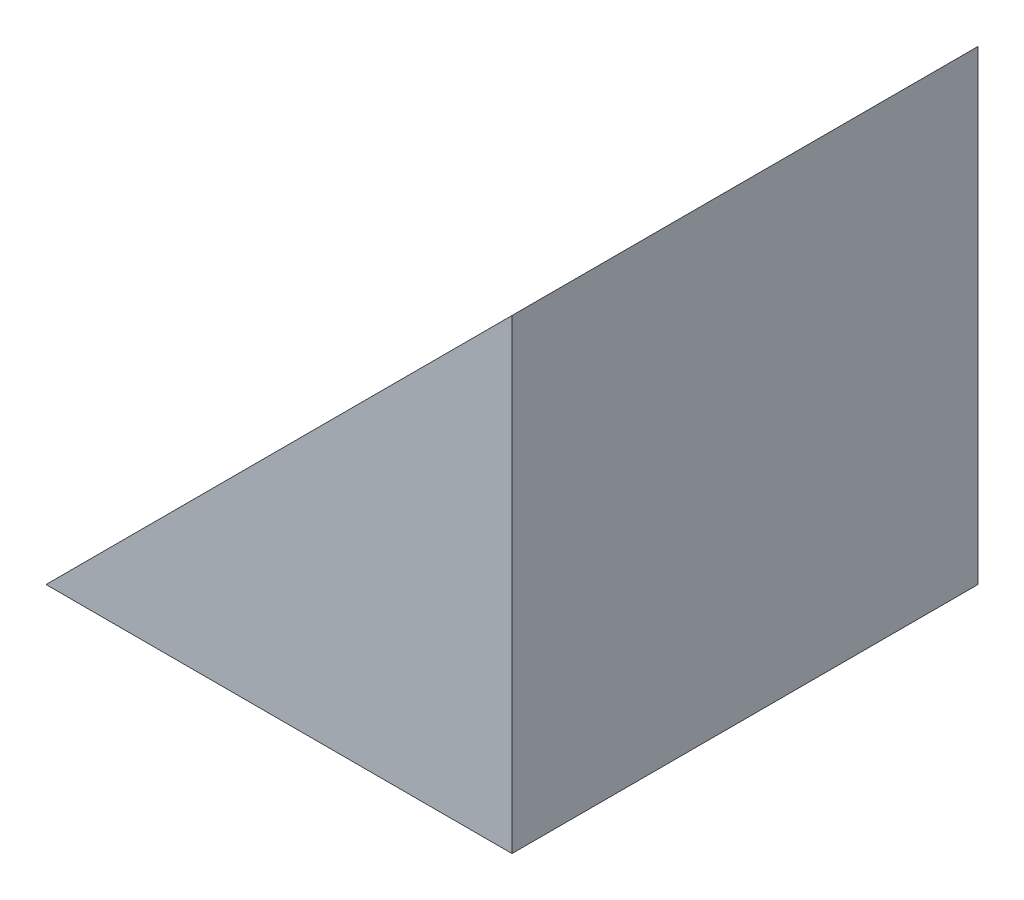
ISO-10303-21;
HEADER;
FILE_DESCRIPTION(('STEP AP214'),'2;1');
FILE_NAME('part.step','',(''),(''),'','','');
FILE_SCHEMA(('AUTOMOTIVE_DESIGN { 1 0 10303 214 1 1 1 1 }'));
ENDSEC;
DATA;
#1=APPLICATION_CONTEXT('core data for automotive mechanical design processes');
#2=APPLICATION_PROTOCOL_DEFINITION('international standard','automotive_design',2000,#1);
#3=PRODUCT_CONTEXT('',#1,'mechanical');
#4=PRODUCT('Part','Part','',(#3));
#5=PRODUCT_RELATED_PRODUCT_CATEGORY('part','',(#4));
#6=PRODUCT_DEFINITION_FORMATION('','',#4);
#7=PRODUCT_DEFINITION_CONTEXT('part definition',#1,'design');
#8=PRODUCT_DEFINITION('design','',#6,#7);
#9=PRODUCT_DEFINITION_SHAPE('','',#8);
#10=(LENGTH_UNIT() NAMED_UNIT(*) SI_UNIT(.MILLI.,.METRE.));
#11=(NAMED_UNIT(*) PLANE_ANGLE_UNIT() SI_UNIT($,.RADIAN.));
#12=(NAMED_UNIT(*) SI_UNIT($,.STERADIAN.) SOLID_ANGLE_UNIT());
#13=UNCERTAINTY_MEASURE_WITH_UNIT(LENGTH_MEASURE(1.E-05),#10,'distance_accuracy_value','');
#14=(GEOMETRIC_REPRESENTATION_CONTEXT(3) GLOBAL_UNCERTAINTY_ASSIGNED_CONTEXT((#13)) GLOBAL_UNIT_ASSIGNED_CONTEXT((#10,
#11,#12)) REPRESENTATION_CONTEXT('',''));
#15=CARTESIAN_POINT('',(0.,0.,0.));
#16=DIRECTION('',(0.,0.,1.));
#17=DIRECTION('',(1.,0.,0.));
#18=AXIS2_PLACEMENT_3D('',#15,#16,#17);
#19=CARTESIAN_POINT('',(1.,1.,2.));
#20=DIRECTION('',(-1.,0.,0.));
#21=DIRECTION('',(0.,-1.,0.));
#22=AXIS2_PLACEMENT_3D('',#19,#20,#21);
#23=PLANE('',#22);
#24=DIRECTION('',(0.,1.,0.));
#25=VECTOR('',#24,1.);
#26=CARTESIAN_POINT('',(1.,1.,0.));
#27=LINE('',#26,#25);
#28=CARTESIAN_POINT('',(1.,-1.,0.));
#29=VERTEX_POINT('',#28);
#30=CARTESIAN_POINT('',(1.,1.,0.));
#31=VERTEX_POINT('',#30);
#32=EDGE_CURVE('E80',#29,#31,#27,.T.);
#33=ORIENTED_EDGE('',*,*,#32,.T.);
#34=DIRECTION('',(0.,0.,-1.));
#35=VECTOR('',#34,1.);
#36=CARTESIAN_POINT('',(1.,1.,2.));
#37=LINE('',#36,#35);
#38=CARTESIAN_POINT('',(1.,1.,2.));
#39=VERTEX_POINT('',#38);
#40=EDGE_CURVE('E11',#39,#31,#37,.T.);
#41=ORIENTED_EDGE('',*,*,#40,.F.);
#42=DIRECTION('',(0.,1.,0.));
#43=VECTOR('',#42,1.);
#44=CARTESIAN_POINT('',(1.,1.,2.));
#45=LINE('',#44,#43);
#46=CARTESIAN_POINT('',(1.,-1.,2.));
#47=VERTEX_POINT('',#46);
#48=EDGE_CURVE('E73',#47,#39,#45,.T.);
#49=ORIENTED_EDGE('',*,*,#48,.F.);
#50=DIRECTION('',(0.,0.,-1.));
#51=VECTOR('',#50,1.);
#52=CARTESIAN_POINT('',(1.,-1.,2.));
#53=LINE('',#52,#51);
#54=EDGE_CURVE('E81',#47,#29,#53,.T.);
#55=ORIENTED_EDGE('',*,*,#54,.T.);
#56=EDGE_LOOP('',(#33,#41,#49,#55));
#57=FACE_BOUND('',#56,.T.);
#58=ADVANCED_FACE('F33',(#57),#23,.F.);
#59=CARTESIAN_POINT('',(1.,1.,2.));
#60=DIRECTION('',(0.707106781186548,-0.707106781186547,0.));
#61=DIRECTION('',(0.707106781186547,0.707106781186548,0.));
#62=AXIS2_PLACEMENT_3D('',#59,#60,#61);
#63=PLANE('',#62);
#64=DIRECTION('',(-0.707106781186548,-0.707106781186548,0.));
#65=VECTOR('',#64,1.);
#66=CARTESIAN_POINT('',(1.,1.,0.));
#67=LINE('',#66,#65);
#68=CARTESIAN_POINT('',(-1.,-1.,0.));
#69=VERTEX_POINT('',#68);
#70=EDGE_CURVE('E61',#31,#69,#67,.T.);
#71=ORIENTED_EDGE('',*,*,#70,.T.);
#72=DIRECTION('',(0.,0.,-1.));
#73=VECTOR('',#72,1.);
#74=CARTESIAN_POINT('',(-1.,-1.,2.));
#75=LINE('',#74,#73);
#76=CARTESIAN_POINT('',(-1.,-1.,2.));
#77=VERTEX_POINT('',#76);
#78=EDGE_CURVE('E41',#77,#69,#75,.T.);
#79=ORIENTED_EDGE('',*,*,#78,.F.);
#80=DIRECTION('',(-0.707106781186548,-0.707106781186548,0.));
#81=VECTOR('',#80,1.);
#82=CARTESIAN_POINT('',(1.,1.,2.));
#83=LINE('',#82,#81);
#84=EDGE_CURVE('E69',#39,#77,#83,.T.);
#85=ORIENTED_EDGE('',*,*,#84,.F.);
#86=ORIENTED_EDGE('',*,*,#40,.T.);
#87=EDGE_LOOP('',(#71,#79,#85,#86));
#88=FACE_BOUND('',#87,.T.);
#89=ADVANCED_FACE('F70',(#88),#63,.F.);
#90=CARTESIAN_POINT('',(-1.,-1.,2.));
#91=DIRECTION('',(0.,1.,0.));
#92=DIRECTION('',(0.,0.,1.));
#93=AXIS2_PLACEMENT_3D('',#90,#91,#92);
#94=PLANE('',#93);
#95=DIRECTION('',(1.,0.,0.));
#96=VECTOR('',#95,1.);
#97=CARTESIAN_POINT('',(-1.,-1.,0.));
#98=LINE('',#97,#96);
#99=EDGE_CURVE('E66',#69,#29,#98,.T.);
#100=ORIENTED_EDGE('',*,*,#99,.T.);
#101=ORIENTED_EDGE('',*,*,#54,.F.);
#102=DIRECTION('',(1.,0.,0.));
#103=VECTOR('',#102,1.);
#104=CARTESIAN_POINT('',(-1.,-1.,2.));
#105=LINE('',#104,#103);
#106=EDGE_CURVE('E49',#77,#47,#105,.T.);
#107=ORIENTED_EDGE('',*,*,#106,.F.);
#108=ORIENTED_EDGE('',*,*,#78,.T.);
#109=EDGE_LOOP('',(#100,#101,#107,#108));
#110=FACE_BOUND('',#109,.T.);
#111=ADVANCED_FACE('F88',(#110),#94,.F.);
#112=CARTESIAN_POINT('',(0.,0.,2.));
#113=DIRECTION('',(0.,0.,1.));
#114=DIRECTION('',(1.,0.,0.));
#115=AXIS2_PLACEMENT_3D('',#112,#113,#114);
#116=PLANE('',#115);
#117=ORIENTED_EDGE('',*,*,#48,.T.);
#118=ORIENTED_EDGE('',*,*,#84,.T.);
#119=ORIENTED_EDGE('',*,*,#106,.T.);
#120=EDGE_LOOP('',(#117,#118,#119));
#121=FACE_BOUND('',#120,.T.);
#122=ADVANCED_FACE('F76',(#121),#116,.T.);
#123=CARTESIAN_POINT('',(0.,0.,0.));
#124=DIRECTION('',(0.,0.,1.));
#125=DIRECTION('',(1.,0.,0.));
#126=AXIS2_PLACEMENT_3D('',#123,#124,#125);
#127=PLANE('',#126);
#128=ORIENTED_EDGE('',*,*,#32,.F.);
#129=ORIENTED_EDGE('',*,*,#99,.F.);
#130=ORIENTED_EDGE('',*,*,#70,.F.);
#131=EDGE_LOOP('',(#128,#129,#130));
#132=FACE_BOUND('',#131,.T.);
#133=ADVANCED_FACE('F89',(#132),#127,.F.);
#134=CLOSED_SHELL('',(#58,#89,#111,#122,#133));
#135=MANIFOLD_SOLID_BREP('B2',#134);
#136=ADVANCED_BREP_SHAPE_REPRESENTATION('',(#18,#135),#14);
#137=SHAPE_DEFINITION_REPRESENTATION(#9,#136);
ENDSEC;
END-ISO-10303-21;
